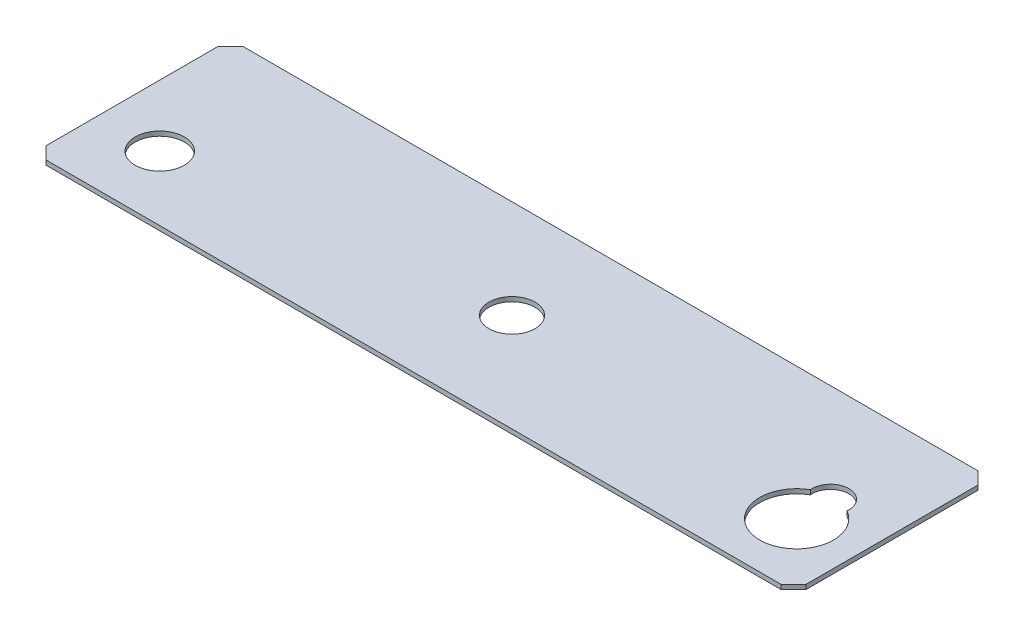
ISO-10303-21;
HEADER;
FILE_DESCRIPTION(('STEP AP214'),'2;1');
FILE_NAME('part.step','',(''),(''),'','','');
FILE_SCHEMA(('AUTOMOTIVE_DESIGN { 1 0 10303 214 1 1 1 1 }'));
ENDSEC;
DATA;
#1=APPLICATION_CONTEXT('core data for automotive mechanical design processes');
#2=APPLICATION_PROTOCOL_DEFINITION('international standard','automotive_design',2000,#1);
#3=PRODUCT_CONTEXT('',#1,'mechanical');
#4=PRODUCT('Part','Part','',(#3));
#5=PRODUCT_RELATED_PRODUCT_CATEGORY('part','',(#4));
#6=PRODUCT_DEFINITION_FORMATION('','',#4);
#7=PRODUCT_DEFINITION_CONTEXT('part definition',#1,'design');
#8=PRODUCT_DEFINITION('design','',#6,#7);
#9=PRODUCT_DEFINITION_SHAPE('','',#8);
#10=(LENGTH_UNIT() NAMED_UNIT(*) SI_UNIT(.MILLI.,.METRE.));
#11=(NAMED_UNIT(*) PLANE_ANGLE_UNIT() SI_UNIT($,.RADIAN.));
#12=(NAMED_UNIT(*) SI_UNIT($,.STERADIAN.) SOLID_ANGLE_UNIT());
#13=UNCERTAINTY_MEASURE_WITH_UNIT(LENGTH_MEASURE(1.E-05),#10,'distance_accuracy_value','');
#14=(GEOMETRIC_REPRESENTATION_CONTEXT(3) GLOBAL_UNCERTAINTY_ASSIGNED_CONTEXT((#13)) GLOBAL_UNIT_ASSIGNED_CONTEXT((#10,
#11,#12)) REPRESENTATION_CONTEXT('',''));
#15=CARTESIAN_POINT('',(0.,0.,0.));
#16=DIRECTION('',(0.,0.,1.));
#17=DIRECTION('',(1.,0.,0.));
#18=AXIS2_PLACEMENT_3D('',#15,#16,#17);
#19=CARTESIAN_POINT('',(0.7366,1.4732,0.));
#20=DIRECTION('',(0.,0.,-1.));
#21=DIRECTION('',(-1.,0.,0.));
#22=AXIS2_PLACEMENT_3D('',#19,#20,#21);
#23=PLANE('',#22);
#24=DIRECTION('',(1.,0.,0.));
#25=VECTOR('',#24,1.);
#26=CARTESIAN_POINT('',(0.,0.,0.));
#27=LINE('',#26,#25);
#28=CARTESIAN_POINT('',(-31.7891728614757,0.,0.));
#29=VERTEX_POINT('',#28);
#30=CARTESIAN_POINT('',(87.7891728614757,0.,0.));
#31=VERTEX_POINT('',#30);
#32=EDGE_CURVE('E135',#29,#31,#27,.T.);
#33=ORIENTED_EDGE('',*,*,#32,.F.);
#34=DIRECTION('',(0.,1.,0.));
#35=VECTOR('',#34,1.);
#36=CARTESIAN_POINT('',(-31.7891728614757,0.736600000000002,0.));
#37=LINE('',#36,#35);
#38=CARTESIAN_POINT('',(-31.7891728614757,0.736600000000002,0.));
#39=VERTEX_POINT('',#38);
#40=EDGE_CURVE('E176',#29,#39,#37,.T.);
#41=ORIENTED_EDGE('',*,*,#40,.T.);
#42=DIRECTION('',(1.,0.,0.));
#43=VECTOR('',#42,1.);
#44=CARTESIAN_POINT('',(0.,0.7366,0.));
#45=LINE('',#44,#43);
#46=CARTESIAN_POINT('',(87.7891728614757,0.736599999999997,0.));
#47=VERTEX_POINT('',#46);
#48=EDGE_CURVE('E196',#39,#47,#45,.T.);
#49=ORIENTED_EDGE('',*,*,#48,.T.);
#50=DIRECTION('',(0.,-1.,0.));
#51=VECTOR('',#50,1.);
#52=CARTESIAN_POINT('',(87.7891728614757,1.4732,0.));
#53=LINE('',#52,#51);
#54=EDGE_CURVE('E148',#47,#31,#53,.T.);
#55=ORIENTED_EDGE('',*,*,#54,.T.);
#56=EDGE_LOOP('',(#33,#41,#49,#55));
#57=FACE_BOUND('',#56,.T.);
#58=ADVANCED_FACE('F51',(#57),#23,.T.);
#59=CARTESIAN_POINT('',(55.2634,1.4732,32.));
#60=DIRECTION('',(0.,0.,1.));
#61=DIRECTION('',(1.,0.,0.));
#62=AXIS2_PLACEMENT_3D('',#59,#60,#61);
#63=PLANE('',#62);
#64=DIRECTION('',(1.,0.,0.));
#65=VECTOR('',#64,1.);
#66=CARTESIAN_POINT('',(0.,0.,32.));
#67=LINE('',#66,#65);
#68=CARTESIAN_POINT('',(-31.7891728614757,0.,32.));
#69=VERTEX_POINT('',#68);
#70=CARTESIAN_POINT('',(87.7891728614757,0.,32.));
#71=VERTEX_POINT('',#70);
#72=EDGE_CURVE('E12',#69,#71,#67,.T.);
#73=ORIENTED_EDGE('',*,*,#72,.T.);
#74=DIRECTION('',(0.,1.,0.));
#75=VECTOR('',#74,1.);
#76=CARTESIAN_POINT('',(87.7891728614757,1.4732,32.));
#77=LINE('',#76,#75);
#78=CARTESIAN_POINT('',(87.7891728614757,0.736599999999997,32.));
#79=VERTEX_POINT('',#78);
#80=EDGE_CURVE('E146',#71,#79,#77,.T.);
#81=ORIENTED_EDGE('',*,*,#80,.T.);
#82=DIRECTION('',(1.,0.,0.));
#83=VECTOR('',#82,1.);
#84=CARTESIAN_POINT('',(0.,0.7366,32.));
#85=LINE('',#84,#83);
#86=CARTESIAN_POINT('',(-31.7891728614757,0.736600000000002,32.));
#87=VERTEX_POINT('',#86);
#88=EDGE_CURVE('E61',#87,#79,#85,.T.);
#89=ORIENTED_EDGE('',*,*,#88,.F.);
#90=DIRECTION('',(0.,-1.,0.));
#91=VECTOR('',#90,1.);
#92=CARTESIAN_POINT('',(-31.7891728614757,1.4732,32.));
#93=LINE('',#92,#91);
#94=EDGE_CURVE('E167',#87,#69,#93,.T.);
#95=ORIENTED_EDGE('',*,*,#94,.T.);
#96=EDGE_LOOP('',(#73,#81,#89,#95));
#97=FACE_BOUND('',#96,.T.);
#98=ADVANCED_FACE('F218',(#97),#63,.T.);
#99=CARTESIAN_POINT('',(0.,0.7366,32.));
#100=DIRECTION('',(0.,1.,0.));
#101=DIRECTION('',(0.,0.,1.));
#102=AXIS2_PLACEMENT_3D('',#99,#100,#101);
#103=PLANE('',#102);
#104=CARTESIAN_POINT('',(28.,0.7366,16.));
#105=DIRECTION('',(0.,1.,0.));
#106=DIRECTION('',(0.,0.,1.));
#107=AXIS2_PLACEMENT_3D('',#104,#105,#106);
#108=CIRCLE('',#107,3.75);
#109=CARTESIAN_POINT('',(28.,0.7366,19.75));
#110=VERTEX_POINT('',#109);
#111=EDGE_CURVE('E169',#110,#110,#108,.T.);
#112=ORIENTED_EDGE('',*,*,#111,.F.);
#113=EDGE_LOOP('',(#112));
#114=FACE_BOUND('',#113,.T.);
#115=ORIENTED_EDGE('',*,*,#48,.F.);
#116=DIRECTION('',(-0.707106781186548,0.,0.707106781186548));
#117=VECTOR('',#116,1.);
#118=CARTESIAN_POINT('',(-31.2891728614757,0.736600000000002,-0.500000000000007));
#119=LINE('',#118,#117);
#120=CARTESIAN_POINT('',(-33.7891728614757,0.736600000000002,2.));
#121=VERTEX_POINT('',#120);
#122=EDGE_CURVE('E180',#39,#121,#119,.T.);
#123=ORIENTED_EDGE('',*,*,#122,.T.);
#124=DIRECTION('',(0.,0.,-1.));
#125=VECTOR('',#124,1.);
#126=CARTESIAN_POINT('',(-33.7891728614757,0.736600000000002,32.));
#127=LINE('',#126,#125);
#128=CARTESIAN_POINT('',(-33.7891728614757,0.736600000000002,30.));
#129=VERTEX_POINT('',#128);
#130=EDGE_CURVE('E191',#129,#121,#127,.T.);
#131=ORIENTED_EDGE('',*,*,#130,.F.);
#132=DIRECTION('',(-0.707106781186548,0.,-0.707106781186548));
#133=VECTOR('',#132,1.);
#134=CARTESIAN_POINT('',(-15.2891728614757,0.736600000000001,48.5));
#135=LINE('',#134,#133);
#136=EDGE_CURVE('E100',#129,#87,#135,.F.);
#137=ORIENTED_EDGE('',*,*,#136,.T.);
#138=ORIENTED_EDGE('',*,*,#88,.T.);
#139=DIRECTION('',(-0.707106781186548,0.,0.707106781186548));
#140=VECTOR('',#139,1.);
#141=CARTESIAN_POINT('',(71.2891728614757,0.736599999999997,48.5));
#142=LINE('',#141,#140);
#143=CARTESIAN_POINT('',(89.7891728614757,0.736599999999997,30.));
#144=VERTEX_POINT('',#143);
#145=EDGE_CURVE('E233',#79,#144,#142,.F.);
#146=ORIENTED_EDGE('',*,*,#145,.T.);
#147=DIRECTION('',(0.,0.,-1.));
#148=VECTOR('',#147,1.);
#149=CARTESIAN_POINT('',(89.7891728614757,0.736599999999997,32.));
#150=LINE('',#149,#148);
#151=CARTESIAN_POINT('',(89.7891728614757,0.736599999999997,2.));
#152=VERTEX_POINT('',#151);
#153=EDGE_CURVE('E158',#144,#152,#150,.T.);
#154=ORIENTED_EDGE('',*,*,#153,.T.);
#155=DIRECTION('',(0.707106781186548,0.,0.707106781186548));
#156=VECTOR('',#155,1.);
#157=CARTESIAN_POINT('',(87.2891728614757,0.736599999999997,-0.500000000000007));
#158=LINE('',#157,#156);
#159=EDGE_CURVE('E235',#152,#47,#158,.F.);
#160=ORIENTED_EDGE('',*,*,#159,.T.);
#161=EDGE_LOOP('',(#115,#123,#131,#137,#138,#146,#154,#160));
#162=FACE_BOUND('',#161,.T.);
#163=CARTESIAN_POINT('',(-23.7891728614757,0.736600000000002,21.5));
#164=DIRECTION('',(0.,1.,0.));
#165=DIRECTION('',(0.,0.,-1.));
#166=AXIS2_PLACEMENT_3D('',#163,#164,#165);
#167=CIRCLE('',#166,4.);
#168=CARTESIAN_POINT('',(-23.7891728614757,0.736600000000002,17.5));
#169=VERTEX_POINT('',#168);
#170=EDGE_CURVE('E185',#169,#169,#167,.T.);
#171=ORIENTED_EDGE('',*,*,#170,.F.);
#172=EDGE_LOOP('',(#171));
#173=FACE_BOUND('',#172,.T.);
#174=CARTESIAN_POINT('',(79.7891728614757,0.736599999999997,16.));
#175=DIRECTION('',(0.,1.,0.));
#176=DIRECTION('',(0.,0.,1.));
#177=AXIS2_PLACEMENT_3D('',#174,#175,#176);
#178=CIRCLE('',#177,3.);
#179=CARTESIAN_POINT('',(82.7745885128667,0.736599999999997,16.2954545454545));
#180=VERTEX_POINT('',#179);
#181=CARTESIAN_POINT('',(76.8037572100847,0.736599999999997,16.2954545454545));
#182=VERTEX_POINT('',#181);
#183=EDGE_CURVE('E246',#180,#182,#178,.T.);
#184=ORIENTED_EDGE('',*,*,#183,.F.);
#185=CARTESIAN_POINT('',(79.7891728614757,0.736599999999997,21.5));
#186=DIRECTION('',(0.,1.,0.));
#187=DIRECTION('',(0.,0.,1.));
#188=AXIS2_PLACEMENT_3D('',#185,#186,#187);
#189=CIRCLE('',#188,6.);
#190=EDGE_CURVE('E159',#182,#180,#189,.T.);
#191=ORIENTED_EDGE('',*,*,#190,.F.);
#192=EDGE_LOOP('',(#184,#191));
#193=FACE_BOUND('',#192,.T.);
#194=ADVANCED_FACE('F53',(#114,#162,#173,#193),#103,.T.);
#195=CARTESIAN_POINT('',(0.,0.,32.));
#196=DIRECTION('',(0.,1.,0.));
#197=DIRECTION('',(0.,0.,1.));
#198=AXIS2_PLACEMENT_3D('',#195,#196,#197);
#199=PLANE('',#198);
#200=CARTESIAN_POINT('',(28.,0.,16.));
#201=DIRECTION('',(0.,1.,0.));
#202=DIRECTION('',(0.,0.,1.));
#203=AXIS2_PLACEMENT_3D('',#200,#201,#202);
#204=CIRCLE('',#203,3.75);
#205=CARTESIAN_POINT('',(28.,0.,19.75));
#206=VERTEX_POINT('',#205);
#207=EDGE_CURVE('E55',#206,#206,#204,.T.);
#208=ORIENTED_EDGE('',*,*,#207,.T.);
#209=EDGE_LOOP('',(#208));
#210=FACE_BOUND('',#209,.T.);
#211=ORIENTED_EDGE('',*,*,#32,.T.);
#212=DIRECTION('',(-0.707106781186548,0.,-0.707106781186548));
#213=VECTOR('',#212,1.);
#214=CARTESIAN_POINT('',(87.7891728614757,0.,0.));
#215=LINE('',#214,#213);
#216=CARTESIAN_POINT('',(89.7891728614757,0.,2.));
#217=VERTEX_POINT('',#216);
#218=EDGE_CURVE('E149',#31,#217,#215,.F.);
#219=ORIENTED_EDGE('',*,*,#218,.T.);
#220=DIRECTION('',(0.,0.,-1.));
#221=VECTOR('',#220,1.);
#222=CARTESIAN_POINT('',(89.7891728614757,0.,32.));
#223=LINE('',#222,#221);
#224=CARTESIAN_POINT('',(89.7891728614757,0.,30.));
#225=VERTEX_POINT('',#224);
#226=EDGE_CURVE('E155',#225,#217,#223,.T.);
#227=ORIENTED_EDGE('',*,*,#226,.F.);
#228=DIRECTION('',(0.707106781186548,0.,-0.707106781186548));
#229=VECTOR('',#228,1.);
#230=CARTESIAN_POINT('',(89.7891728614757,0.,30.));
#231=LINE('',#230,#229);
#232=EDGE_CURVE('E141',#225,#71,#231,.F.);
#233=ORIENTED_EDGE('',*,*,#232,.T.);
#234=ORIENTED_EDGE('',*,*,#72,.F.);
#235=DIRECTION('',(0.707106781186548,0.,0.707106781186548));
#236=VECTOR('',#235,1.);
#237=CARTESIAN_POINT('',(-33.7891728614757,0.,30.));
#238=LINE('',#237,#236);
#239=CARTESIAN_POINT('',(-33.7891728614757,0.,30.));
#240=VERTEX_POINT('',#239);
#241=EDGE_CURVE('E170',#69,#240,#238,.F.);
#242=ORIENTED_EDGE('',*,*,#241,.T.);
#243=DIRECTION('',(0.,0.,-1.));
#244=VECTOR('',#243,1.);
#245=CARTESIAN_POINT('',(-33.7891728614757,0.,32.));
#246=LINE('',#245,#244);
#247=CARTESIAN_POINT('',(-33.7891728614757,0.,2.));
#248=VERTEX_POINT('',#247);
#249=EDGE_CURVE('E174',#240,#248,#246,.T.);
#250=ORIENTED_EDGE('',*,*,#249,.T.);
#251=DIRECTION('',(0.707106781186548,0.,-0.707106781186548));
#252=VECTOR('',#251,1.);
#253=CARTESIAN_POINT('',(-31.7891728614757,0.,0.));
#254=LINE('',#253,#252);
#255=EDGE_CURVE('E172',#248,#29,#254,.T.);
#256=ORIENTED_EDGE('',*,*,#255,.T.);
#257=EDGE_LOOP('',(#211,#219,#227,#233,#234,#242,#250,#256));
#258=FACE_BOUND('',#257,.T.);
#259=CARTESIAN_POINT('',(-23.7891728614757,0.,21.5));
#260=DIRECTION('',(0.,-1.,0.));
#261=DIRECTION('',(0.,0.,1.));
#262=AXIS2_PLACEMENT_3D('',#259,#260,#261);
#263=CIRCLE('',#262,4.);
#264=CARTESIAN_POINT('',(-23.7891728614757,0.,25.5));
#265=VERTEX_POINT('',#264);
#266=EDGE_CURVE('E182',#265,#265,#263,.T.);
#267=ORIENTED_EDGE('',*,*,#266,.F.);
#268=EDGE_LOOP('',(#267));
#269=FACE_BOUND('',#268,.T.);
#270=CARTESIAN_POINT('',(79.7891728614757,0.,21.5));
#271=DIRECTION('',(0.,-1.,0.));
#272=DIRECTION('',(0.,0.,-1.));
#273=AXIS2_PLACEMENT_3D('',#270,#271,#272);
#274=CIRCLE('',#273,6.);
#275=CARTESIAN_POINT('',(82.7745885128667,0.,16.2954545454545));
#276=VERTEX_POINT('',#275);
#277=CARTESIAN_POINT('',(76.8037572100847,0.,16.2954545454545));
#278=VERTEX_POINT('',#277);
#279=EDGE_CURVE('E249',#276,#278,#274,.T.);
#280=ORIENTED_EDGE('',*,*,#279,.F.);
#281=CARTESIAN_POINT('',(79.7891728614757,0.,16.));
#282=DIRECTION('',(0.,-1.,0.));
#283=DIRECTION('',(0.,0.,-1.));
#284=AXIS2_PLACEMENT_3D('',#281,#282,#283);
#285=CIRCLE('',#284,3.);
#286=EDGE_CURVE('E242',#278,#276,#285,.T.);
#287=ORIENTED_EDGE('',*,*,#286,.F.);
#288=EDGE_LOOP('',(#280,#287));
#289=FACE_BOUND('',#288,.T.);
#290=ADVANCED_FACE('F162',(#210,#258,#269,#289),#199,.F.);
#291=CARTESIAN_POINT('',(28.,-9.2634,16.));
#292=DIRECTION('',(0.,1.,0.));
#293=DIRECTION('',(0.,0.,1.));
#294=AXIS2_PLACEMENT_3D('',#291,#292,#293);
#295=CYLINDRICAL_SURFACE('',#294,3.75);
#296=ORIENTED_EDGE('',*,*,#111,.T.);
#297=EDGE_LOOP('',(#296));
#298=FACE_BOUND('',#297,.T.);
#299=ORIENTED_EDGE('',*,*,#207,.F.);
#300=EDGE_LOOP('',(#299));
#301=FACE_BOUND('',#300,.T.);
#302=ADVANCED_FACE('F204',(#298,#301),#295,.F.);
#303=CARTESIAN_POINT('',(-33.7891728614757,0.,30.));
#304=DIRECTION('',(0.707106781186547,0.,-0.707106781186547));
#305=DIRECTION('',(0.,1.,0.));
#306=AXIS2_PLACEMENT_3D('',#303,#304,#305);
#307=PLANE('',#306);
#308=ORIENTED_EDGE('',*,*,#241,.F.);
#309=ORIENTED_EDGE('',*,*,#94,.F.);
#310=ORIENTED_EDGE('',*,*,#136,.F.);
#311=DIRECTION('',(0.,1.,0.));
#312=VECTOR('',#311,1.);
#313=CARTESIAN_POINT('',(-33.7891728614757,0.,30.));
#314=LINE('',#313,#312);
#315=EDGE_CURVE('E188',#240,#129,#314,.T.);
#316=ORIENTED_EDGE('',*,*,#315,.F.);
#317=EDGE_LOOP('',(#308,#309,#310,#316));
#318=FACE_BOUND('',#317,.T.);
#319=ADVANCED_FACE('F206',(#318),#307,.F.);
#320=CARTESIAN_POINT('',(-33.7891728614757,0.,32.));
#321=DIRECTION('',(-1.,0.,0.));
#322=DIRECTION('',(0.,0.,1.));
#323=AXIS2_PLACEMENT_3D('',#320,#321,#322);
#324=PLANE('',#323);
#325=ORIENTED_EDGE('',*,*,#130,.T.);
#326=DIRECTION('',(0.,-1.,0.));
#327=VECTOR('',#326,1.);
#328=CARTESIAN_POINT('',(-33.7891728614757,0.,2.));
#329=LINE('',#328,#327);
#330=EDGE_CURVE('E92',#121,#248,#329,.T.);
#331=ORIENTED_EDGE('',*,*,#330,.T.);
#332=ORIENTED_EDGE('',*,*,#249,.F.);
#333=ORIENTED_EDGE('',*,*,#315,.T.);
#334=EDGE_LOOP('',(#325,#331,#332,#333));
#335=FACE_BOUND('',#334,.T.);
#336=ADVANCED_FACE('F213',(#335),#324,.T.);
#337=CARTESIAN_POINT('',(-31.7891728614757,54.5268,0.));
#338=DIRECTION('',(-0.707106781186547,0.,-0.707106781186547));
#339=DIRECTION('',(0.,-1.,0.));
#340=AXIS2_PLACEMENT_3D('',#337,#338,#339);
#341=PLANE('',#340);
#342=ORIENTED_EDGE('',*,*,#255,.F.);
#343=ORIENTED_EDGE('',*,*,#330,.F.);
#344=ORIENTED_EDGE('',*,*,#122,.F.);
#345=ORIENTED_EDGE('',*,*,#40,.F.);
#346=EDGE_LOOP('',(#342,#343,#344,#345));
#347=FACE_BOUND('',#346,.T.);
#348=ADVANCED_FACE('F228',(#347),#341,.T.);
#349=CARTESIAN_POINT('',(-23.7891728614757,10.,21.5));
#350=DIRECTION('',(0.,-1.,0.));
#351=DIRECTION('',(0.,0.,1.));
#352=AXIS2_PLACEMENT_3D('',#349,#350,#351);
#353=CYLINDRICAL_SURFACE('',#352,4.);
#354=ORIENTED_EDGE('',*,*,#170,.T.);
#355=EDGE_LOOP('',(#354));
#356=FACE_BOUND('',#355,.T.);
#357=ORIENTED_EDGE('',*,*,#266,.T.);
#358=EDGE_LOOP('',(#357));
#359=FACE_BOUND('',#358,.T.);
#360=ADVANCED_FACE('F379',(#356,#359),#353,.F.);
#361=CARTESIAN_POINT('',(89.7891728614757,0.736599999999997,30.));
#362=DIRECTION('',(-0.707106781186547,0.,-0.707106781186547));
#363=DIRECTION('',(0.,-1.,0.));
#364=AXIS2_PLACEMENT_3D('',#361,#362,#363);
#365=PLANE('',#364);
#366=ORIENTED_EDGE('',*,*,#145,.F.);
#367=ORIENTED_EDGE('',*,*,#80,.F.);
#368=ORIENTED_EDGE('',*,*,#232,.F.);
#369=DIRECTION('',(0.,-1.,0.));
#370=VECTOR('',#369,1.);
#371=CARTESIAN_POINT('',(89.7891728614757,0.736599999999997,30.));
#372=LINE('',#371,#370);
#373=EDGE_CURVE('E145',#144,#225,#372,.T.);
#374=ORIENTED_EDGE('',*,*,#373,.F.);
#375=EDGE_LOOP('',(#366,#367,#368,#374));
#376=FACE_BOUND('',#375,.T.);
#377=ADVANCED_FACE('F144',(#376),#365,.F.);
#378=CARTESIAN_POINT('',(87.7891728614757,1.4732,0.));
#379=DIRECTION('',(-0.707106781186547,0.,0.707106781186547));
#380=DIRECTION('',(0.,-1.,0.));
#381=AXIS2_PLACEMENT_3D('',#378,#379,#380);
#382=PLANE('',#381);
#383=ORIENTED_EDGE('',*,*,#159,.F.);
#384=DIRECTION('',(0.,1.,0.));
#385=VECTOR('',#384,1.);
#386=CARTESIAN_POINT('',(89.7891728614757,0.736599999999997,2.));
#387=LINE('',#386,#385);
#388=EDGE_CURVE('E160',#217,#152,#387,.T.);
#389=ORIENTED_EDGE('',*,*,#388,.F.);
#390=ORIENTED_EDGE('',*,*,#218,.F.);
#391=ORIENTED_EDGE('',*,*,#54,.F.);
#392=EDGE_LOOP('',(#383,#389,#390,#391));
#393=FACE_BOUND('',#392,.T.);
#394=ADVANCED_FACE('F360',(#393),#382,.F.);
#395=CARTESIAN_POINT('',(89.7891728614757,0.736599999999997,32.));
#396=DIRECTION('',(1.,0.,0.));
#397=DIRECTION('',(0.,0.,1.));
#398=AXIS2_PLACEMENT_3D('',#395,#396,#397);
#399=PLANE('',#398);
#400=ORIENTED_EDGE('',*,*,#226,.T.);
#401=ORIENTED_EDGE('',*,*,#388,.T.);
#402=ORIENTED_EDGE('',*,*,#153,.F.);
#403=ORIENTED_EDGE('',*,*,#373,.T.);
#404=EDGE_LOOP('',(#400,#401,#402,#403));
#405=FACE_BOUND('',#404,.T.);
#406=ADVANCED_FACE('F154',(#405),#399,.T.);
#407=CARTESIAN_POINT('',(79.7891728614757,10.,21.5));
#408=DIRECTION('',(0.,-1.,0.));
#409=DIRECTION('',(0.,0.,-1.));
#410=AXIS2_PLACEMENT_3D('',#407,#408,#409);
#411=CYLINDRICAL_SURFACE('',#410,6.);
#412=ORIENTED_EDGE('',*,*,#190,.T.);
#413=DIRECTION('',(0.,-1.,0.));
#414=VECTOR('',#413,1.);
#415=CARTESIAN_POINT('',(82.7745885128667,10.,16.2954545454545));
#416=LINE('',#415,#414);
#417=EDGE_CURVE('E252',#180,#276,#416,.T.);
#418=ORIENTED_EDGE('',*,*,#417,.T.);
#419=ORIENTED_EDGE('',*,*,#279,.T.);
#420=DIRECTION('',(0.,-1.,0.));
#421=VECTOR('',#420,1.);
#422=CARTESIAN_POINT('',(76.8037572100847,10.,16.2954545454545));
#423=LINE('',#422,#421);
#424=EDGE_CURVE('E244',#182,#278,#423,.T.);
#425=ORIENTED_EDGE('',*,*,#424,.F.);
#426=EDGE_LOOP('',(#412,#418,#419,#425));
#427=FACE_BOUND('',#426,.T.);
#428=ADVANCED_FACE('F258',(#427),#411,.F.);
#429=CARTESIAN_POINT('',(79.7891728614757,10.,16.));
#430=DIRECTION('',(0.,-1.,0.));
#431=DIRECTION('',(0.,0.,-1.));
#432=AXIS2_PLACEMENT_3D('',#429,#430,#431);
#433=CYLINDRICAL_SURFACE('',#432,3.);
#434=ORIENTED_EDGE('',*,*,#183,.T.);
#435=ORIENTED_EDGE('',*,*,#424,.T.);
#436=ORIENTED_EDGE('',*,*,#286,.T.);
#437=ORIENTED_EDGE('',*,*,#417,.F.);
#438=EDGE_LOOP('',(#434,#435,#436,#437));
#439=FACE_BOUND('',#438,.T.);
#440=ADVANCED_FACE('F263',(#439),#433,.F.);
#441=CLOSED_SHELL('',(#58,#98,#194,#290,#302,#319,#336,#348,#360,#377,#394,#406,#428,#440));
#442=MANIFOLD_SOLID_BREP('B2',#441);
#443=ADVANCED_BREP_SHAPE_REPRESENTATION('',(#18,#442),#14);
#444=SHAPE_DEFINITION_REPRESENTATION(#9,#443);
ENDSEC;
END-ISO-10303-21;
